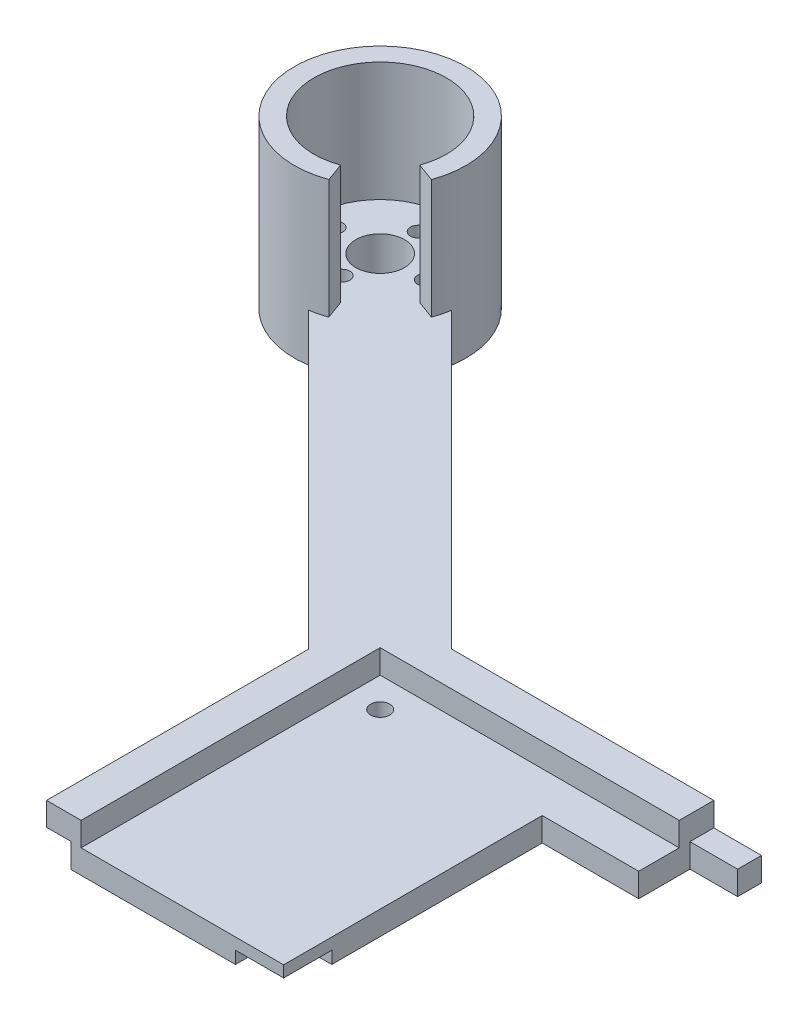
ISO-10303-21;
HEADER;
FILE_DESCRIPTION(('STEP AP214'),'2;1');
FILE_NAME('part.step','',(''),(''),'','','');
FILE_SCHEMA(('AUTOMOTIVE_DESIGN { 1 0 10303 214 1 1 1 1 }'));
ENDSEC;
DATA;
#1=APPLICATION_CONTEXT('core data for automotive mechanical design processes');
#2=APPLICATION_PROTOCOL_DEFINITION('international standard','automotive_design',2000,#1);
#3=PRODUCT_CONTEXT('',#1,'mechanical');
#4=PRODUCT('Part','Part','',(#3));
#5=PRODUCT_RELATED_PRODUCT_CATEGORY('part','',(#4));
#6=PRODUCT_DEFINITION_FORMATION('','',#4);
#7=PRODUCT_DEFINITION_CONTEXT('part definition',#1,'design');
#8=PRODUCT_DEFINITION('design','',#6,#7);
#9=PRODUCT_DEFINITION_SHAPE('','',#8);
#10=(LENGTH_UNIT() NAMED_UNIT(*) SI_UNIT(.MILLI.,.METRE.));
#11=(NAMED_UNIT(*) PLANE_ANGLE_UNIT() SI_UNIT($,.RADIAN.));
#12=(NAMED_UNIT(*) SI_UNIT($,.STERADIAN.) SOLID_ANGLE_UNIT());
#13=UNCERTAINTY_MEASURE_WITH_UNIT(LENGTH_MEASURE(1.E-05),#10,'distance_accuracy_value','');
#14=(GEOMETRIC_REPRESENTATION_CONTEXT(3) GLOBAL_UNCERTAINTY_ASSIGNED_CONTEXT((#13)) GLOBAL_UNIT_ASSIGNED_CONTEXT((#10,
#11,#12)) REPRESENTATION_CONTEXT('',''));
#15=CARTESIAN_POINT('',(0.,0.,0.));
#16=DIRECTION('',(0.,0.,1.));
#17=DIRECTION('',(1.,0.,0.));
#18=AXIS2_PLACEMENT_3D('',#15,#16,#17);
#19=CARTESIAN_POINT('',(0.,-10.01,-249.205352090915));
#20=DIRECTION('',(-1.,0.,0.));
#21=DIRECTION('',(0.,0.,1.));
#22=AXIS2_PLACEMENT_3D('',#19,#20,#21);
#23=PLANE('',#22);
#24=DIRECTION('',(0.,-1.,0.));
#25=VECTOR('',#24,1.);
#26=CARTESIAN_POINT('',(0.,-10.,-65.));
#27=LINE('',#26,#25);
#28=CARTESIAN_POINT('',(0.,-5.,-65.));
#29=VERTEX_POINT('',#28);
#30=CARTESIAN_POINT('',(0.,-10.,-65.));
#31=VERTEX_POINT('',#30);
#32=EDGE_CURVE('E279',#29,#31,#27,.T.);
#33=ORIENTED_EDGE('',*,*,#32,.F.);
#34=DIRECTION('',(0.,0.,1.));
#35=VECTOR('',#34,1.);
#36=CARTESIAN_POINT('',(0.,-5.,-70.));
#37=LINE('',#36,#35);
#38=CARTESIAN_POINT('',(0.,-5.,-70.));
#39=VERTEX_POINT('',#38);
#40=EDGE_CURVE('E290',#39,#29,#37,.T.);
#41=ORIENTED_EDGE('',*,*,#40,.F.);
#42=DIRECTION('',(0.,1.,0.));
#43=VECTOR('',#42,1.);
#44=CARTESIAN_POINT('',(0.,-10.,-70.));
#45=LINE('',#44,#43);
#46=CARTESIAN_POINT('',(0.,0.,-70.));
#47=VERTEX_POINT('',#46);
#48=EDGE_CURVE('E493',#39,#47,#45,.T.);
#49=ORIENTED_EDGE('',*,*,#48,.T.);
#50=DIRECTION('',(0.,0.,1.));
#51=VECTOR('',#50,1.);
#52=CARTESIAN_POINT('',(0.,0.,-134.350288425444));
#53=LINE('',#52,#51);
#54=CARTESIAN_POINT('',(0.,0.,-62.75));
#55=VERTEX_POINT('',#54);
#56=EDGE_CURVE('E489',#47,#55,#53,.T.);
#57=ORIENTED_EDGE('',*,*,#56,.T.);
#58=DIRECTION('',(0.,1.,0.));
#59=VECTOR('',#58,1.);
#60=CARTESIAN_POINT('',(0.,-5.,-62.75));
#61=LINE('',#60,#59);
#62=CARTESIAN_POINT('',(0.,-5.,-62.75));
#63=VERTEX_POINT('',#62);
#64=EDGE_CURVE('E469',#63,#55,#61,.T.);
#65=ORIENTED_EDGE('',*,*,#64,.F.);
#66=DIRECTION('',(0.,0.,1.));
#67=VECTOR('',#66,1.);
#68=CARTESIAN_POINT('',(0.,-5.,0.));
#69=LINE('',#68,#67);
#70=CARTESIAN_POINT('',(0.,-5.,-54.25));
#71=VERTEX_POINT('',#70);
#72=EDGE_CURVE('E51',#63,#71,#69,.T.);
#73=ORIENTED_EDGE('',*,*,#72,.T.);
#74=DIRECTION('',(0.,1.,0.));
#75=VECTOR('',#74,1.);
#76=CARTESIAN_POINT('',(0.,-10.,-54.25));
#77=LINE('',#76,#75);
#78=CARTESIAN_POINT('',(0.,-10.,-54.25));
#79=VERTEX_POINT('',#78);
#80=EDGE_CURVE('E495',#79,#71,#77,.T.);
#81=ORIENTED_EDGE('',*,*,#80,.F.);
#82=DIRECTION('',(0.,0.,1.));
#83=VECTOR('',#82,1.);
#84=CARTESIAN_POINT('',(0.,-10.,-134.350288425444));
#85=LINE('',#84,#83);
#86=EDGE_CURVE('E499',#31,#79,#85,.T.);
#87=ORIENTED_EDGE('',*,*,#86,.F.);
#88=EDGE_LOOP('',(#33,#41,#49,#57,#65,#73,#81,#87));
#89=FACE_BOUND('',#88,.T.);
#90=ADVANCED_FACE('F41',(#89),#23,.F.);
#91=CARTESIAN_POINT('',(-210.827922049848,-10.01,0.));
#92=DIRECTION('',(0.,0.,1.));
#93=DIRECTION('',(1.,0.,0.));
#94=AXIS2_PLACEMENT_3D('',#91,#92,#93);
#95=PLANE('',#94);
#96=DIRECTION('',(-1.,0.,0.));
#97=VECTOR('',#96,1.);
#98=CARTESIAN_POINT('',(-70.,-4.9,0.));
#99=LINE('',#98,#97);
#100=CARTESIAN_POINT('',(-64.9,-4.9,0.));
#101=VERTEX_POINT('',#100);
#102=CARTESIAN_POINT('',(-70.,-4.9,0.));
#103=VERTEX_POINT('',#102);
#104=EDGE_CURVE('E517',#101,#103,#99,.T.);
#105=ORIENTED_EDGE('',*,*,#104,.F.);
#106=DIRECTION('',(0.,1.,0.));
#107=VECTOR('',#106,1.);
#108=CARTESIAN_POINT('',(-64.9,-10.,0.));
#109=LINE('',#108,#107);
#110=CARTESIAN_POINT('',(-64.9,-10.,0.));
#111=VERTEX_POINT('',#110);
#112=EDGE_CURVE('E268',#111,#101,#109,.T.);
#113=ORIENTED_EDGE('',*,*,#112,.F.);
#114=DIRECTION('',(1.,0.,0.));
#115=VECTOR('',#114,1.);
#116=CARTESIAN_POINT('',(134.350288425444,-10.,0.));
#117=LINE('',#116,#115);
#118=CARTESIAN_POINT('',(-30.35,-10.,0.));
#119=VERTEX_POINT('',#118);
#120=EDGE_CURVE('E235',#111,#119,#117,.T.);
#121=ORIENTED_EDGE('',*,*,#120,.T.);
#122=DIRECTION('',(0.,-1.,0.));
#123=VECTOR('',#122,1.);
#124=CARTESIAN_POINT('',(-30.35,-10.,0.));
#125=LINE('',#124,#123);
#126=CARTESIAN_POINT('',(-30.35,-7.4,0.));
#127=VERTEX_POINT('',#126);
#128=EDGE_CURVE('E250',#127,#119,#125,.T.);
#129=ORIENTED_EDGE('',*,*,#128,.F.);
#130=DIRECTION('',(-1.,0.,0.));
#131=VECTOR('',#130,1.);
#132=CARTESIAN_POINT('',(-20.25,-7.4,0.));
#133=LINE('',#132,#131);
#134=CARTESIAN_POINT('',(-20.25,-7.4,0.));
#135=VERTEX_POINT('',#134);
#136=EDGE_CURVE('E259',#135,#127,#133,.T.);
#137=ORIENTED_EDGE('',*,*,#136,.F.);
#138=DIRECTION('',(0.,1.,0.));
#139=VECTOR('',#138,1.);
#140=CARTESIAN_POINT('',(-20.25,-10.,0.));
#141=LINE('',#140,#139);
#142=CARTESIAN_POINT('',(-20.25,-5.,0.));
#143=VERTEX_POINT('',#142);
#144=EDGE_CURVE('E494',#135,#143,#141,.T.);
#145=ORIENTED_EDGE('',*,*,#144,.T.);
#146=DIRECTION('',(1.,0.,0.));
#147=VECTOR('',#146,1.);
#148=CARTESIAN_POINT('',(0.,-5.,0.));
#149=LINE('',#148,#147);
#150=CARTESIAN_POINT('',(-62.75,-5.,0.));
#151=VERTEX_POINT('',#150);
#152=EDGE_CURVE('E484',#151,#143,#149,.T.);
#153=ORIENTED_EDGE('',*,*,#152,.F.);
#154=DIRECTION('',(0.,1.,0.));
#155=VECTOR('',#154,1.);
#156=CARTESIAN_POINT('',(-62.75,-5.,0.));
#157=LINE('',#156,#155);
#158=CARTESIAN_POINT('',(-62.75,0.,0.));
#159=VERTEX_POINT('',#158);
#160=EDGE_CURVE('E11',#151,#159,#157,.T.);
#161=ORIENTED_EDGE('',*,*,#160,.T.);
#162=DIRECTION('',(1.,0.,0.));
#163=VECTOR('',#162,1.);
#164=CARTESIAN_POINT('',(134.350288425444,0.,0.));
#165=LINE('',#164,#163);
#166=CARTESIAN_POINT('',(-70.,0.,0.));
#167=VERTEX_POINT('',#166);
#168=EDGE_CURVE('E498',#167,#159,#165,.T.);
#169=ORIENTED_EDGE('',*,*,#168,.F.);
#170=DIRECTION('',(0.,1.,0.));
#171=VECTOR('',#170,1.);
#172=CARTESIAN_POINT('',(-70.,-10.,0.));
#173=LINE('',#172,#171);
#174=EDGE_CURVE('E45',#103,#167,#173,.T.);
#175=ORIENTED_EDGE('',*,*,#174,.F.);
#176=EDGE_LOOP('',(#105,#113,#121,#129,#137,#145,#153,#161,#169,#175));
#177=FACE_BOUND('',#176,.T.);
#178=ADVANCED_FACE('F43',(#177),#95,.T.);
#179=CARTESIAN_POINT('',(0.,25.,0.));
#180=DIRECTION('',(0.,1.,0.));
#181=DIRECTION('',(1.,0.,0.));
#182=AXIS2_PLACEMENT_3D('',#179,#180,#181);
#183=PLANE('',#182);
#184=CARTESIAN_POINT('',(-134.350288425443,25.,-134.350288425445));
#185=DIRECTION('',(0.,1.,0.));
#186=DIRECTION('',(1.,0.,0.));
#187=AXIS2_PLACEMENT_3D('',#184,#185,#186);
#188=CIRCLE('',#187,18.);
#189=CARTESIAN_POINT('',(-117.435821251297,25.,-128.193925845584));
#190=VERTEX_POINT('',#189);
#191=CARTESIAN_POINT('',(-128.193925845581,25.,-117.4358212513));
#192=VERTEX_POINT('',#191);
#193=EDGE_CURVE('E333',#190,#192,#188,.T.);
#194=ORIENTED_EDGE('',*,*,#193,.T.);
#195=DIRECTION('',(0.342020143325692,0.,0.9396926207859));
#196=VECTOR('',#195,1.);
#197=CARTESIAN_POINT('',(-75.4549397737436,25.,27.4633521059938));
#198=LINE('',#197,#196);
#199=CARTESIAN_POINT('',(-129.596208433216,25.,-121.288560996521));
#200=VERTEX_POINT('',#199);
#201=EDGE_CURVE('E336',#200,#192,#198,.T.);
#202=ORIENTED_EDGE('',*,*,#201,.F.);
#203=CARTESIAN_POINT('',(-134.350288425443,25.,-134.350288425445));
#204=DIRECTION('',(0.,1.,0.));
#205=DIRECTION('',(1.,0.,0.));
#206=AXIS2_PLACEMENT_3D('',#203,#204,#205);
#207=CIRCLE('',#206,13.9);
#208=CARTESIAN_POINT('',(-121.288560996518,25.,-129.596208433219));
#209=VERTEX_POINT('',#208);
#210=EDGE_CURVE('E341',#209,#200,#207,.T.);
#211=ORIENTED_EDGE('',*,*,#210,.F.);
#212=DIRECTION('',(-0.939692620785907,0.,-0.342020143325674));
#213=VECTOR('',#212,1.);
#214=CARTESIAN_POINT('',(27.4633521059948,25.,-75.454939773751));
#215=LINE('',#214,#213);
#216=EDGE_CURVE('E345',#190,#209,#215,.T.);
#217=ORIENTED_EDGE('',*,*,#216,.F.);
#218=EDGE_LOOP('',(#194,#202,#211,#217));
#219=FACE_BOUND('',#218,.T.);
#220=ADVANCED_FACE('F544',(#219),#183,.T.);
#221=CARTESIAN_POINT('',(-75.4549397737436,25.,27.4633521059938));
#222=DIRECTION('',(0.9396926207859,0.,-0.342020143325692));
#223=DIRECTION('',(-0.342020143325692,0.,-0.9396926207859));
#224=AXIS2_PLACEMENT_3D('',#221,#222,#223);
#225=PLANE('',#224);
#226=DIRECTION('',(0.342020143325692,0.,0.9396926207859));
#227=VECTOR('',#226,1.);
#228=CARTESIAN_POINT('',(-75.4549397737436,0.,27.4633521059938));
#229=LINE('',#228,#227);
#230=CARTESIAN_POINT('',(-129.596208433216,0.,-121.288560996521));
#231=VERTEX_POINT('',#230);
#232=CARTESIAN_POINT('',(-128.193925845581,0.,-117.4358212513));
#233=VERTEX_POINT('',#232);
#234=EDGE_CURVE('E354',#231,#233,#229,.T.);
#235=ORIENTED_EDGE('',*,*,#234,.F.);
#236=DIRECTION('',(0.,-1.,0.));
#237=VECTOR('',#236,1.);
#238=CARTESIAN_POINT('',(-129.596208433216,25.,-121.288560996521));
#239=LINE('',#238,#237);
#240=EDGE_CURVE('E369',#200,#231,#239,.T.);
#241=ORIENTED_EDGE('',*,*,#240,.F.);
#242=ORIENTED_EDGE('',*,*,#201,.T.);
#243=DIRECTION('',(0.,-1.,0.));
#244=VECTOR('',#243,1.);
#245=CARTESIAN_POINT('',(-128.193925845581,25.,-117.4358212513));
#246=LINE('',#245,#244);
#247=EDGE_CURVE('E373',#192,#233,#246,.T.);
#248=ORIENTED_EDGE('',*,*,#247,.T.);
#249=EDGE_LOOP('',(#235,#241,#242,#248));
#250=FACE_BOUND('',#249,.T.);
#251=ADVANCED_FACE('F540',(#250),#225,.T.);
#252=CARTESIAN_POINT('',(-134.350288425443,25.,-134.350288425445));
#253=DIRECTION('',(0.,-1.,0.));
#254=DIRECTION('',(0.,0.,-1.));
#255=AXIS2_PLACEMENT_3D('',#252,#253,#254);
#256=CYLINDRICAL_SURFACE('',#255,13.9);
#257=CARTESIAN_POINT('',(-134.350288425443,0.,-134.350288425445));
#258=DIRECTION('',(0.,1.,0.));
#259=DIRECTION('',(1.,0.,0.));
#260=AXIS2_PLACEMENT_3D('',#257,#258,#259);
#261=CIRCLE('',#260,13.9);
#262=CARTESIAN_POINT('',(-121.288560996518,0.,-129.596208433219));
#263=VERTEX_POINT('',#262);
#264=EDGE_CURVE('E357',#263,#231,#261,.T.);
#265=ORIENTED_EDGE('',*,*,#264,.F.);
#266=DIRECTION('',(0.,-1.,0.));
#267=VECTOR('',#266,1.);
#268=CARTESIAN_POINT('',(-121.288560996518,25.,-129.596208433219));
#269=LINE('',#268,#267);
#270=EDGE_CURVE('E365',#209,#263,#269,.T.);
#271=ORIENTED_EDGE('',*,*,#270,.F.);
#272=ORIENTED_EDGE('',*,*,#210,.T.);
#273=ORIENTED_EDGE('',*,*,#240,.T.);
#274=EDGE_LOOP('',(#265,#271,#272,#273));
#275=FACE_BOUND('',#274,.T.);
#276=ADVANCED_FACE('F548',(#275),#256,.F.);
#277=CARTESIAN_POINT('',(27.4633521059948,25.,-75.454939773751));
#278=DIRECTION('',(-0.342020143325674,0.,0.939692620785907));
#279=DIRECTION('',(0.939692620785907,0.,0.342020143325674));
#280=AXIS2_PLACEMENT_3D('',#277,#278,#279);
#281=PLANE('',#280);
#282=DIRECTION('',(-0.939692620785907,0.,-0.342020143325674));
#283=VECTOR('',#282,1.);
#284=CARTESIAN_POINT('',(27.4633521059948,0.,-75.454939773751));
#285=LINE('',#284,#283);
#286=CARTESIAN_POINT('',(-117.435821251297,0.,-128.193925845584));
#287=VERTEX_POINT('',#286);
#288=EDGE_CURVE('E337',#287,#263,#285,.T.);
#289=ORIENTED_EDGE('',*,*,#288,.F.);
#290=DIRECTION('',(0.,-1.,0.));
#291=VECTOR('',#290,1.);
#292=CARTESIAN_POINT('',(-117.435821251297,25.,-128.193925845584));
#293=LINE('',#292,#291);
#294=EDGE_CURVE('E349',#190,#287,#293,.T.);
#295=ORIENTED_EDGE('',*,*,#294,.F.);
#296=ORIENTED_EDGE('',*,*,#216,.T.);
#297=ORIENTED_EDGE('',*,*,#270,.T.);
#298=EDGE_LOOP('',(#289,#295,#296,#297));
#299=FACE_BOUND('',#298,.T.);
#300=ADVANCED_FACE('F551',(#299),#281,.T.);
#301=CARTESIAN_POINT('',(-55.,-10.,-70.));
#302=DIRECTION('',(0.,0.,-1.));
#303=DIRECTION('',(-1.,0.,0.));
#304=AXIS2_PLACEMENT_3D('',#301,#302,#303);
#305=PLANE('',#304);
#306=ORIENTED_EDGE('',*,*,#48,.F.);
#307=DIRECTION('',(-1.,0.,0.));
#308=VECTOR('',#307,1.);
#309=CARTESIAN_POINT('',(10.,-5.,-70.));
#310=LINE('',#309,#308);
#311=CARTESIAN_POINT('',(10.,-5.,-70.));
#312=VERTEX_POINT('',#311);
#313=EDGE_CURVE('E304',#312,#39,#310,.T.);
#314=ORIENTED_EDGE('',*,*,#313,.F.);
#315=DIRECTION('',(0.,1.,0.));
#316=VECTOR('',#315,1.);
#317=CARTESIAN_POINT('',(10.,-10.,-70.));
#318=LINE('',#317,#316);
#319=CARTESIAN_POINT('',(10.,-10.,-70.));
#320=VERTEX_POINT('',#319);
#321=EDGE_CURVE('E274',#320,#312,#318,.T.);
#322=ORIENTED_EDGE('',*,*,#321,.F.);
#323=DIRECTION('',(-1.,0.,0.));
#324=VECTOR('',#323,1.);
#325=CARTESIAN_POINT('',(-55.,-10.,-70.));
#326=LINE('',#325,#324);
#327=CARTESIAN_POINT('',(-55.,-10.,-70.));
#328=VERTEX_POINT('',#327);
#329=EDGE_CURVE('E433',#320,#328,#326,.T.);
#330=ORIENTED_EDGE('',*,*,#329,.T.);
#331=DIRECTION('',(0.,1.,0.));
#332=VECTOR('',#331,1.);
#333=CARTESIAN_POINT('',(-55.,-10.,-70.));
#334=LINE('',#333,#332);
#335=CARTESIAN_POINT('',(-55.,0.,-70.));
#336=VERTEX_POINT('',#335);
#337=EDGE_CURVE('E452',#328,#336,#334,.T.);
#338=ORIENTED_EDGE('',*,*,#337,.T.);
#339=DIRECTION('',(-1.,0.,0.));
#340=VECTOR('',#339,1.);
#341=CARTESIAN_POINT('',(-55.,0.,-70.));
#342=LINE('',#341,#340);
#343=EDGE_CURVE('E432',#47,#336,#342,.T.);
#344=ORIENTED_EDGE('',*,*,#343,.F.);
#345=EDGE_LOOP('',(#306,#314,#322,#330,#338,#344));
#346=FACE_BOUND('',#345,.T.);
#347=ADVANCED_FACE('F580',(#346),#305,.T.);
#348=CARTESIAN_POINT('',(-55.,-10.,-70.));
#349=DIRECTION('',(0.707106781186547,0.,-0.707106781186548));
#350=DIRECTION('',(-0.707106781186548,0.,-0.707106781186547));
#351=AXIS2_PLACEMENT_3D('',#348,#349,#350);
#352=PLANE('',#351);
#353=DIRECTION('',(-0.707106781186548,0.,-0.707106781186547));
#354=VECTOR('',#353,1.);
#355=CARTESIAN_POINT('',(-55.,0.,-70.));
#356=LINE('',#355,#354);
#357=CARTESIAN_POINT('',(-116.566806524842,0.,-131.566806524842));
#358=VERTEX_POINT('',#357);
#359=EDGE_CURVE('E455',#336,#358,#356,.T.);
#360=ORIENTED_EDGE('',*,*,#359,.F.);
#361=ORIENTED_EDGE('',*,*,#337,.F.);
#362=DIRECTION('',(-0.707106781186548,0.,-0.707106781186547));
#363=VECTOR('',#362,1.);
#364=CARTESIAN_POINT('',(-55.,-10.,-70.));
#365=LINE('',#364,#363);
#366=CARTESIAN_POINT('',(-116.566806524842,-10.,-131.566806524842));
#367=VERTEX_POINT('',#366);
#368=EDGE_CURVE('E436',#328,#367,#365,.T.);
#369=ORIENTED_EDGE('',*,*,#368,.T.);
#370=DIRECTION('',(0.,1.,0.));
#371=VECTOR('',#370,1.);
#372=CARTESIAN_POINT('',(-116.566806524842,-10.,-131.566806524842));
#373=LINE('',#372,#371);
#374=EDGE_CURVE('E474',#367,#358,#373,.T.);
#375=ORIENTED_EDGE('',*,*,#374,.T.);
#376=EDGE_LOOP('',(#360,#361,#369,#375));
#377=FACE_BOUND('',#376,.T.);
#378=ADVANCED_FACE('F559',(#377),#352,.T.);
#379=CARTESIAN_POINT('',(-134.350288425444,-10.,-134.350288425444));
#380=DIRECTION('',(0.,1.,0.));
#381=DIRECTION('',(0.,0.,1.));
#382=AXIS2_PLACEMENT_3D('',#379,#380,#381);
#383=CYLINDRICAL_SURFACE('',#382,18.);
#384=DIRECTION('',(0.,1.,0.));
#385=VECTOR('',#384,1.);
#386=CARTESIAN_POINT('',(-131.566806524842,-10.,-116.566806524842));
#387=LINE('',#386,#385);
#388=CARTESIAN_POINT('',(-131.566806524842,-10.,-116.566806524842));
#389=VERTEX_POINT('',#388);
#390=CARTESIAN_POINT('',(-131.566806524843,0.,-116.566806524844));
#391=VERTEX_POINT('',#390);
#392=EDGE_CURVE('E470',#389,#391,#387,.T.);
#393=ORIENTED_EDGE('',*,*,#392,.T.);
#394=CARTESIAN_POINT('',(-134.350288425443,0.,-134.350288425445));
#395=DIRECTION('',(0.,1.,0.));
#396=DIRECTION('',(1.,0.,0.));
#397=AXIS2_PLACEMENT_3D('',#394,#395,#396);
#398=CIRCLE('',#397,18.);
#399=EDGE_CURVE('E332',#391,#233,#398,.T.);
#400=ORIENTED_EDGE('',*,*,#399,.T.);
#401=ORIENTED_EDGE('',*,*,#247,.F.);
#402=ORIENTED_EDGE('',*,*,#193,.F.);
#403=ORIENTED_EDGE('',*,*,#294,.T.);
#404=EDGE_CURVE('E350',#287,#358,#398,.T.);
#405=ORIENTED_EDGE('',*,*,#404,.T.);
#406=ORIENTED_EDGE('',*,*,#374,.F.);
#407=CARTESIAN_POINT('',(-134.350288425444,-10.,-134.350288425444));
#408=DIRECTION('',(0.,1.,0.));
#409=DIRECTION('',(0.,0.,1.));
#410=AXIS2_PLACEMENT_3D('',#407,#408,#409);
#411=CIRCLE('',#410,18.);
#412=EDGE_CURVE('E441',#367,#389,#411,.T.);
#413=ORIENTED_EDGE('',*,*,#412,.T.);
#414=EDGE_LOOP('',(#393,#400,#401,#402,#403,#405,#406,#413));
#415=FACE_BOUND('',#414,.T.);
#416=ADVANCED_FACE('F535',(#415),#383,.T.);
#417=CARTESIAN_POINT('',(-70.,-10.,-55.));
#418=DIRECTION('',(-0.707106781186547,0.,0.707106781186548));
#419=DIRECTION('',(0.707106781186548,0.,0.707106781186547));
#420=AXIS2_PLACEMENT_3D('',#417,#418,#419);
#421=PLANE('',#420);
#422=DIRECTION('',(0.707106781186548,0.,0.707106781186547));
#423=VECTOR('',#422,1.);
#424=CARTESIAN_POINT('',(-70.,0.,-55.));
#425=LINE('',#424,#423);
#426=CARTESIAN_POINT('',(-70.,0.,-55.));
#427=VERTEX_POINT('',#426);
#428=EDGE_CURVE('E459',#391,#427,#425,.T.);
#429=ORIENTED_EDGE('',*,*,#428,.F.);
#430=ORIENTED_EDGE('',*,*,#392,.F.);
#431=DIRECTION('',(0.707106781186548,0.,0.707106781186547));
#432=VECTOR('',#431,1.);
#433=CARTESIAN_POINT('',(-70.,-10.,-55.));
#434=LINE('',#433,#432);
#435=CARTESIAN_POINT('',(-70.,-10.,-55.));
#436=VERTEX_POINT('',#435);
#437=EDGE_CURVE('E445',#389,#436,#434,.T.);
#438=ORIENTED_EDGE('',*,*,#437,.T.);
#439=DIRECTION('',(0.,1.,0.));
#440=VECTOR('',#439,1.);
#441=CARTESIAN_POINT('',(-70.,-10.,-55.));
#442=LINE('',#441,#440);
#443=EDGE_CURVE('E466',#436,#427,#442,.T.);
#444=ORIENTED_EDGE('',*,*,#443,.T.);
#445=EDGE_LOOP('',(#429,#430,#438,#444));
#446=FACE_BOUND('',#445,.T.);
#447=ADVANCED_FACE('F564',(#446),#421,.T.);
#448=CARTESIAN_POINT('',(-70.,-10.,-55.));
#449=DIRECTION('',(-1.,0.,0.));
#450=DIRECTION('',(0.,0.,1.));
#451=AXIS2_PLACEMENT_3D('',#448,#449,#450);
#452=PLANE('',#451);
#453=DIRECTION('',(0.,0.,1.));
#454=VECTOR('',#453,1.);
#455=CARTESIAN_POINT('',(-70.,-4.9,-10.1));
#456=LINE('',#455,#454);
#457=CARTESIAN_POINT('',(-70.,-4.9,-10.1));
#458=VERTEX_POINT('',#457);
#459=EDGE_CURVE('E240',#458,#103,#456,.T.);
#460=ORIENTED_EDGE('',*,*,#459,.T.);
#461=ORIENTED_EDGE('',*,*,#174,.T.);
#462=DIRECTION('',(0.,0.,1.));
#463=VECTOR('',#462,1.);
#464=CARTESIAN_POINT('',(-70.,0.,-55.));
#465=LINE('',#464,#463);
#466=EDGE_CURVE('E437',#427,#167,#465,.T.);
#467=ORIENTED_EDGE('',*,*,#466,.F.);
#468=ORIENTED_EDGE('',*,*,#443,.F.);
#469=DIRECTION('',(0.,0.,1.));
#470=VECTOR('',#469,1.);
#471=CARTESIAN_POINT('',(-70.,-10.,-55.));
#472=LINE('',#471,#470);
#473=CARTESIAN_POINT('',(-70.,-10.,-10.1));
#474=VERTEX_POINT('',#473);
#475=EDGE_CURVE('E449',#436,#474,#472,.T.);
#476=ORIENTED_EDGE('',*,*,#475,.T.);
#477=DIRECTION('',(0.,-1.,0.));
#478=VECTOR('',#477,1.);
#479=CARTESIAN_POINT('',(-70.,-10.,-10.1));
#480=LINE('',#479,#478);
#481=EDGE_CURVE('E67',#458,#474,#480,.T.);
#482=ORIENTED_EDGE('',*,*,#481,.F.);
#483=EDGE_LOOP('',(#460,#461,#467,#468,#476,#482));
#484=FACE_BOUND('',#483,.T.);
#485=ADVANCED_FACE('F525',(#484),#452,.T.);
#486=CARTESIAN_POINT('',(-134.350288425444,-10.,-134.350288425444));
#487=DIRECTION('',(0.,1.,0.));
#488=DIRECTION('',(0.,0.,1.));
#489=AXIS2_PLACEMENT_3D('',#486,#487,#488);
#490=CYLINDRICAL_SURFACE('',#489,5.10000000000054);
#491=CARTESIAN_POINT('',(-134.350288425444,-10.,-134.350288425444));
#492=DIRECTION('',(0.,1.,0.));
#493=DIRECTION('',(0.,0.,1.));
#494=AXIS2_PLACEMENT_3D('',#491,#492,#493);
#495=CIRCLE('',#494,5.10000000000054);
#496=CARTESIAN_POINT('',(-134.350288425444,-10.,-129.250288425444));
#497=VERTEX_POINT('',#496);
#498=EDGE_CURVE('E378',#497,#497,#495,.T.);
#499=ORIENTED_EDGE('',*,*,#498,.F.);
#500=EDGE_LOOP('',(#499));
#501=FACE_BOUND('',#500,.T.);
#502=CARTESIAN_POINT('',(-134.350288425444,0.,-134.350288425444));
#503=DIRECTION('',(0.,1.,0.));
#504=DIRECTION('',(0.,0.,1.));
#505=AXIS2_PLACEMENT_3D('',#502,#503,#504);
#506=CIRCLE('',#505,5.10000000000054);
#507=CARTESIAN_POINT('',(-134.350288425444,0.,-129.250288425444));
#508=VERTEX_POINT('',#507);
#509=EDGE_CURVE('E377',#508,#508,#506,.T.);
#510=ORIENTED_EDGE('',*,*,#509,.T.);
#511=EDGE_LOOP('',(#510));
#512=FACE_BOUND('',#511,.T.);
#513=ADVANCED_FACE('F622',(#501,#512),#490,.F.);
#514=CARTESIAN_POINT('',(-143.850288425444,-10.,-134.350288425444));
#515=DIRECTION('',(0.,1.,0.));
#516=DIRECTION('',(0.,0.,1.));
#517=AXIS2_PLACEMENT_3D('',#514,#515,#516);
#518=CYLINDRICAL_SURFACE('',#517,1.65000000000002);
#519=CARTESIAN_POINT('',(-143.850288425444,-10.,-134.350288425444));
#520=DIRECTION('',(0.,1.,0.));
#521=DIRECTION('',(0.,0.,1.));
#522=AXIS2_PLACEMENT_3D('',#519,#520,#521);
#523=CIRCLE('',#522,1.65000000000002);
#524=CARTESIAN_POINT('',(-143.850288425444,-10.,-132.700288425444));
#525=VERTEX_POINT('',#524);
#526=EDGE_CURVE('E386',#525,#525,#523,.T.);
#527=ORIENTED_EDGE('',*,*,#526,.F.);
#528=EDGE_LOOP('',(#527));
#529=FACE_BOUND('',#528,.T.);
#530=CARTESIAN_POINT('',(-143.850288425444,0.,-134.350288425444));
#531=DIRECTION('',(0.,1.,0.));
#532=DIRECTION('',(0.,0.,1.));
#533=AXIS2_PLACEMENT_3D('',#530,#531,#532);
#534=CIRCLE('',#533,1.65000000000002);
#535=CARTESIAN_POINT('',(-143.850288425444,0.,-132.700288425444));
#536=VERTEX_POINT('',#535);
#537=EDGE_CURVE('E382',#536,#536,#534,.T.);
#538=ORIENTED_EDGE('',*,*,#537,.T.);
#539=EDGE_LOOP('',(#538));
#540=FACE_BOUND('',#539,.T.);
#541=ADVANCED_FACE('F650',(#529,#540),#518,.F.);
#542=CARTESIAN_POINT('',(-134.350288425444,-10.,-142.350288425444));
#543=DIRECTION('',(0.,1.,0.));
#544=DIRECTION('',(0.,0.,1.));
#545=AXIS2_PLACEMENT_3D('',#542,#543,#544);
#546=CYLINDRICAL_SURFACE('',#545,1.65000000000065);
#547=CARTESIAN_POINT('',(-134.350288425444,-10.,-142.350288425444));
#548=DIRECTION('',(0.,1.,0.));
#549=DIRECTION('',(0.,0.,1.));
#550=AXIS2_PLACEMENT_3D('',#547,#548,#549);
#551=CIRCLE('',#550,1.65000000000065);
#552=CARTESIAN_POINT('',(-134.350288425444,-10.,-140.700288425443));
#553=VERTEX_POINT('',#552);
#554=EDGE_CURVE('E394',#553,#553,#551,.T.);
#555=ORIENTED_EDGE('',*,*,#554,.F.);
#556=EDGE_LOOP('',(#555));
#557=FACE_BOUND('',#556,.T.);
#558=CARTESIAN_POINT('',(-134.350288425444,0.,-142.350288425444));
#559=DIRECTION('',(0.,1.,0.));
#560=DIRECTION('',(0.,0.,1.));
#561=AXIS2_PLACEMENT_3D('',#558,#559,#560);
#562=CIRCLE('',#561,1.65000000000065);
#563=CARTESIAN_POINT('',(-134.350288425444,0.,-140.700288425443));
#564=VERTEX_POINT('',#563);
#565=EDGE_CURVE('E390',#564,#564,#562,.T.);
#566=ORIENTED_EDGE('',*,*,#565,.T.);
#567=EDGE_LOOP('',(#566));
#568=FACE_BOUND('',#567,.T.);
#569=ADVANCED_FACE('F646',(#557,#568),#546,.F.);
#570=CARTESIAN_POINT('',(-134.350288425444,-10.,-126.350288425444));
#571=DIRECTION('',(0.,1.,0.));
#572=DIRECTION('',(0.,0.,1.));
#573=AXIS2_PLACEMENT_3D('',#570,#571,#572);
#574=CYLINDRICAL_SURFACE('',#573,1.65000000000002);
#575=CARTESIAN_POINT('',(-134.350288425444,-10.,-126.350288425444));
#576=DIRECTION('',(0.,1.,0.));
#577=DIRECTION('',(0.,0.,1.));
#578=AXIS2_PLACEMENT_3D('',#575,#576,#577);
#579=CIRCLE('',#578,1.65000000000002);
#580=CARTESIAN_POINT('',(-134.350288425444,-10.,-124.700288425444));
#581=VERTEX_POINT('',#580);
#582=EDGE_CURVE('E402',#581,#581,#579,.T.);
#583=ORIENTED_EDGE('',*,*,#582,.F.);
#584=EDGE_LOOP('',(#583));
#585=FACE_BOUND('',#584,.T.);
#586=CARTESIAN_POINT('',(-134.350288425444,0.,-126.350288425444));
#587=DIRECTION('',(0.,1.,0.));
#588=DIRECTION('',(0.,0.,1.));
#589=AXIS2_PLACEMENT_3D('',#586,#587,#588);
#590=CIRCLE('',#589,1.65000000000002);
#591=CARTESIAN_POINT('',(-134.350288425444,0.,-124.700288425444));
#592=VERTEX_POINT('',#591);
#593=EDGE_CURVE('E398',#592,#592,#590,.T.);
#594=ORIENTED_EDGE('',*,*,#593,.T.);
#595=EDGE_LOOP('',(#594));
#596=FACE_BOUND('',#595,.T.);
#597=ADVANCED_FACE('F642',(#585,#596),#574,.F.);
#598=CARTESIAN_POINT('',(-124.850288425444,-10.,-134.350288425444));
#599=DIRECTION('',(0.,1.,0.));
#600=DIRECTION('',(0.,0.,1.));
#601=AXIS2_PLACEMENT_3D('',#598,#599,#600);
#602=CYLINDRICAL_SURFACE('',#601,1.65000000000054);
#603=CARTESIAN_POINT('',(-124.850288425444,-10.,-134.350288425444));
#604=DIRECTION('',(0.,1.,0.));
#605=DIRECTION('',(0.,0.,1.));
#606=AXIS2_PLACEMENT_3D('',#603,#604,#605);
#607=CIRCLE('',#606,1.65000000000054);
#608=CARTESIAN_POINT('',(-124.850288425444,-10.,-132.700288425443));
#609=VERTEX_POINT('',#608);
#610=EDGE_CURVE('E410',#609,#609,#607,.T.);
#611=ORIENTED_EDGE('',*,*,#610,.F.);
#612=EDGE_LOOP('',(#611));
#613=FACE_BOUND('',#612,.T.);
#614=CARTESIAN_POINT('',(-124.850288425444,0.,-134.350288425444));
#615=DIRECTION('',(0.,1.,0.));
#616=DIRECTION('',(0.,0.,1.));
#617=AXIS2_PLACEMENT_3D('',#614,#615,#616);
#618=CIRCLE('',#617,1.65000000000054);
#619=CARTESIAN_POINT('',(-124.850288425444,0.,-132.700288425443));
#620=VERTEX_POINT('',#619);
#621=EDGE_CURVE('E406',#620,#620,#618,.T.);
#622=ORIENTED_EDGE('',*,*,#621,.T.);
#623=EDGE_LOOP('',(#622));
#624=FACE_BOUND('',#623,.T.);
#625=ADVANCED_FACE('F631',(#613,#624),#602,.F.);
#626=CARTESIAN_POINT('',(-20.25,-10.,-54.25));
#627=DIRECTION('',(0.,0.,-1.));
#628=DIRECTION('',(-1.,0.,0.));
#629=AXIS2_PLACEMENT_3D('',#626,#627,#628);
#630=PLANE('',#629);
#631=DIRECTION('',(-1.,0.,0.));
#632=VECTOR('',#631,1.);
#633=CARTESIAN_POINT('',(-20.25,-10.,-54.25));
#634=LINE('',#633,#632);
#635=CARTESIAN_POINT('',(-20.25,-10.,-54.25));
#636=VERTEX_POINT('',#635);
#637=EDGE_CURVE('E421',#79,#636,#634,.T.);
#638=ORIENTED_EDGE('',*,*,#637,.F.);
#639=ORIENTED_EDGE('',*,*,#80,.T.);
#640=DIRECTION('',(1.,0.,0.));
#641=VECTOR('',#640,1.);
#642=CARTESIAN_POINT('',(-20.25,-5.,-54.25));
#643=LINE('',#642,#641);
#644=CARTESIAN_POINT('',(-20.25,-5.,-54.25));
#645=VERTEX_POINT('',#644);
#646=EDGE_CURVE('E325',#645,#71,#643,.T.);
#647=ORIENTED_EDGE('',*,*,#646,.F.);
#648=DIRECTION('',(0.,1.,0.));
#649=VECTOR('',#648,1.);
#650=CARTESIAN_POINT('',(-20.25,-10.,-54.25));
#651=LINE('',#650,#649);
#652=EDGE_CURVE('E428',#636,#645,#651,.T.);
#653=ORIENTED_EDGE('',*,*,#652,.F.);
#654=EDGE_LOOP('',(#638,#639,#647,#653));
#655=FACE_BOUND('',#654,.T.);
#656=ADVANCED_FACE('F627',(#655),#630,.F.);
#657=CARTESIAN_POINT('',(-20.25,-10.,-54.25));
#658=DIRECTION('',(-1.,0.,0.));
#659=DIRECTION('',(0.,0.,1.));
#660=AXIS2_PLACEMENT_3D('',#657,#658,#659);
#661=PLANE('',#660);
#662=ORIENTED_EDGE('',*,*,#144,.F.);
#663=DIRECTION('',(0.,0.,1.));
#664=VECTOR('',#663,1.);
#665=CARTESIAN_POINT('',(-20.25,-7.4,-10.1));
#666=LINE('',#665,#664);
#667=CARTESIAN_POINT('',(-20.25,-7.4,-10.1));
#668=VERTEX_POINT('',#667);
#669=EDGE_CURVE('E258',#668,#135,#666,.T.);
#670=ORIENTED_EDGE('',*,*,#669,.F.);
#671=DIRECTION('',(0.,1.,0.));
#672=VECTOR('',#671,1.);
#673=CARTESIAN_POINT('',(-20.25,-10.,-10.1));
#674=LINE('',#673,#672);
#675=CARTESIAN_POINT('',(-20.25,-10.,-10.1));
#676=VERTEX_POINT('',#675);
#677=EDGE_CURVE('E245',#676,#668,#674,.T.);
#678=ORIENTED_EDGE('',*,*,#677,.F.);
#679=DIRECTION('',(0.,0.,1.));
#680=VECTOR('',#679,1.);
#681=CARTESIAN_POINT('',(-20.25,-10.,-54.25));
#682=LINE('',#681,#680);
#683=EDGE_CURVE('E424',#636,#676,#682,.T.);
#684=ORIENTED_EDGE('',*,*,#683,.F.);
#685=ORIENTED_EDGE('',*,*,#652,.T.);
#686=DIRECTION('',(0.,0.,-1.));
#687=VECTOR('',#686,1.);
#688=CARTESIAN_POINT('',(-20.25,-5.,-54.25));
#689=LINE('',#688,#687);
#690=EDGE_CURVE('E329',#143,#645,#689,.T.);
#691=ORIENTED_EDGE('',*,*,#690,.F.);
#692=EDGE_LOOP('',(#662,#670,#678,#684,#685,#691));
#693=FACE_BOUND('',#692,.T.);
#694=ADVANCED_FACE('F630',(#693),#661,.F.);
#695=CARTESIAN_POINT('',(-56.5,-10.,-56.4999999999999));
#696=DIRECTION('',(0.,1.,0.));
#697=DIRECTION('',(0.,0.,1.));
#698=AXIS2_PLACEMENT_3D('',#695,#696,#697);
#699=CYLINDRICAL_SURFACE('',#698,2.00000000000005);
#700=CARTESIAN_POINT('',(-56.5,-10.,-56.4999999999999));
#701=DIRECTION('',(0.,1.,0.));
#702=DIRECTION('',(0.,0.,1.));
#703=AXIS2_PLACEMENT_3D('',#700,#701,#702);
#704=CIRCLE('',#703,2.00000000000005);
#705=CARTESIAN_POINT('',(-56.5,-10.,-54.4999999999998));
#706=VERTEX_POINT('',#705);
#707=EDGE_CURVE('E414',#706,#706,#704,.T.);
#708=ORIENTED_EDGE('',*,*,#707,.F.);
#709=EDGE_LOOP('',(#708));
#710=FACE_BOUND('',#709,.T.);
#711=CARTESIAN_POINT('',(-56.5,-5.,-56.4999999999999));
#712=DIRECTION('',(0.,1.,0.));
#713=DIRECTION('',(0.,0.,1.));
#714=AXIS2_PLACEMENT_3D('',#711,#712,#713);
#715=CIRCLE('',#714,2.00000000000005);
#716=CARTESIAN_POINT('',(-56.5,-5.,-54.4999999999998));
#717=VERTEX_POINT('',#716);
#718=EDGE_CURVE('E324',#717,#717,#715,.F.);
#719=ORIENTED_EDGE('',*,*,#718,.F.);
#720=EDGE_LOOP('',(#719));
#721=FACE_BOUND('',#720,.T.);
#722=ADVANCED_FACE('F635',(#710,#721),#699,.F.);
#723=CARTESIAN_POINT('',(-62.75,-5.,-62.75));
#724=DIRECTION('',(-1.,0.,0.));
#725=DIRECTION('',(0.,0.,1.));
#726=AXIS2_PLACEMENT_3D('',#723,#724,#725);
#727=PLANE('',#726);
#728=ORIENTED_EDGE('',*,*,#160,.F.);
#729=DIRECTION('',(0.,0.,1.));
#730=VECTOR('',#729,1.);
#731=CARTESIAN_POINT('',(-62.75,-5.,-62.75));
#732=LINE('',#731,#730);
#733=CARTESIAN_POINT('',(-62.75,-5.,-62.75));
#734=VERTEX_POINT('',#733);
#735=EDGE_CURVE('E312',#734,#151,#732,.T.);
#736=ORIENTED_EDGE('',*,*,#735,.F.);
#737=DIRECTION('',(0.,1.,0.));
#738=VECTOR('',#737,1.);
#739=CARTESIAN_POINT('',(-62.75,-5.,-62.75));
#740=LINE('',#739,#738);
#741=CARTESIAN_POINT('',(-62.75,0.,-62.75));
#742=VERTEX_POINT('',#741);
#743=EDGE_CURVE('E316',#734,#742,#740,.T.);
#744=ORIENTED_EDGE('',*,*,#743,.T.);
#745=DIRECTION('',(0.,0.,1.));
#746=VECTOR('',#745,1.);
#747=CARTESIAN_POINT('',(-62.75,0.,-62.75));
#748=LINE('',#747,#746);
#749=EDGE_CURVE('E313',#742,#159,#748,.T.);
#750=ORIENTED_EDGE('',*,*,#749,.T.);
#751=EDGE_LOOP('',(#728,#736,#744,#750));
#752=FACE_BOUND('',#751,.T.);
#753=ADVANCED_FACE('F571',(#752),#727,.F.);
#754=CARTESIAN_POINT('',(134.350288425444,0.,-134.350288425444));
#755=DIRECTION('',(0.,1.,0.));
#756=DIRECTION('',(0.,0.,1.));
#757=AXIS2_PLACEMENT_3D('',#754,#755,#756);
#758=PLANE('',#757);
#759=ORIENTED_EDGE('',*,*,#621,.F.);
#760=EDGE_LOOP('',(#759));
#761=FACE_BOUND('',#760,.T.);
#762=ORIENTED_EDGE('',*,*,#593,.F.);
#763=EDGE_LOOP('',(#762));
#764=FACE_BOUND('',#763,.T.);
#765=ORIENTED_EDGE('',*,*,#565,.F.);
#766=EDGE_LOOP('',(#765));
#767=FACE_BOUND('',#766,.T.);
#768=ORIENTED_EDGE('',*,*,#537,.F.);
#769=EDGE_LOOP('',(#768));
#770=FACE_BOUND('',#769,.T.);
#771=ORIENTED_EDGE('',*,*,#509,.F.);
#772=EDGE_LOOP('',(#771));
#773=FACE_BOUND('',#772,.T.);
#774=ORIENTED_EDGE('',*,*,#466,.T.);
#775=ORIENTED_EDGE('',*,*,#168,.T.);
#776=ORIENTED_EDGE('',*,*,#749,.F.);
#777=DIRECTION('',(-1.,0.,0.));
#778=VECTOR('',#777,1.);
#779=CARTESIAN_POINT('',(-62.75,0.,-62.75));
#780=LINE('',#779,#778);
#781=EDGE_CURVE('E308',#55,#742,#780,.T.);
#782=ORIENTED_EDGE('',*,*,#781,.F.);
#783=ORIENTED_EDGE('',*,*,#56,.F.);
#784=ORIENTED_EDGE('',*,*,#343,.T.);
#785=ORIENTED_EDGE('',*,*,#359,.T.);
#786=ORIENTED_EDGE('',*,*,#404,.F.);
#787=ORIENTED_EDGE('',*,*,#288,.T.);
#788=ORIENTED_EDGE('',*,*,#264,.T.);
#789=ORIENTED_EDGE('',*,*,#234,.T.);
#790=ORIENTED_EDGE('',*,*,#399,.F.);
#791=ORIENTED_EDGE('',*,*,#428,.T.);
#792=EDGE_LOOP('',(#774,#775,#776,#782,#783,#784,#785,#786,#787,#788,#789,#790,#791));
#793=FACE_BOUND('',#792,.T.);
#794=ADVANCED_FACE('F553',(#761,#764,#767,#770,#773,#793),#758,.T.);
#795=CARTESIAN_POINT('',(0.,-5.,0.));
#796=DIRECTION('',(0.,1.,0.));
#797=DIRECTION('',(0.,0.,1.));
#798=AXIS2_PLACEMENT_3D('',#795,#796,#797);
#799=PLANE('',#798);
#800=ORIENTED_EDGE('',*,*,#718,.T.);
#801=EDGE_LOOP('',(#800));
#802=FACE_BOUND('',#801,.T.);
#803=ORIENTED_EDGE('',*,*,#735,.T.);
#804=ORIENTED_EDGE('',*,*,#152,.T.);
#805=ORIENTED_EDGE('',*,*,#690,.T.);
#806=ORIENTED_EDGE('',*,*,#646,.T.);
#807=ORIENTED_EDGE('',*,*,#72,.F.);
#808=DIRECTION('',(-1.,0.,0.));
#809=VECTOR('',#808,1.);
#810=CARTESIAN_POINT('',(-62.75,-5.,-62.75));
#811=LINE('',#810,#809);
#812=EDGE_CURVE('E309',#63,#734,#811,.T.);
#813=ORIENTED_EDGE('',*,*,#812,.T.);
#814=EDGE_LOOP('',(#803,#804,#805,#806,#807,#813));
#815=FACE_BOUND('',#814,.T.);
#816=ADVANCED_FACE('F624',(#802,#815),#799,.T.);
#817=CARTESIAN_POINT('',(-62.75,-5.,-62.75));
#818=DIRECTION('',(0.,0.,-1.));
#819=DIRECTION('',(-1.,0.,0.));
#820=AXIS2_PLACEMENT_3D('',#817,#818,#819);
#821=PLANE('',#820);
#822=ORIENTED_EDGE('',*,*,#812,.F.);
#823=ORIENTED_EDGE('',*,*,#64,.T.);
#824=ORIENTED_EDGE('',*,*,#781,.T.);
#825=ORIENTED_EDGE('',*,*,#743,.F.);
#826=EDGE_LOOP('',(#822,#823,#824,#825));
#827=FACE_BOUND('',#826,.T.);
#828=ADVANCED_FACE('F575',(#827),#821,.F.);
#829=CARTESIAN_POINT('',(134.350288425444,-10.,-134.350288425444));
#830=DIRECTION('',(0.,1.,0.));
#831=DIRECTION('',(0.,0.,1.));
#832=AXIS2_PLACEMENT_3D('',#829,#830,#831);
#833=PLANE('',#832);
#834=ORIENTED_EDGE('',*,*,#707,.T.);
#835=EDGE_LOOP('',(#834));
#836=FACE_BOUND('',#835,.T.);
#837=ORIENTED_EDGE('',*,*,#610,.T.);
#838=EDGE_LOOP('',(#837));
#839=FACE_BOUND('',#838,.T.);
#840=ORIENTED_EDGE('',*,*,#582,.T.);
#841=EDGE_LOOP('',(#840));
#842=FACE_BOUND('',#841,.T.);
#843=ORIENTED_EDGE('',*,*,#554,.T.);
#844=EDGE_LOOP('',(#843));
#845=FACE_BOUND('',#844,.T.);
#846=ORIENTED_EDGE('',*,*,#526,.T.);
#847=EDGE_LOOP('',(#846));
#848=FACE_BOUND('',#847,.T.);
#849=ORIENTED_EDGE('',*,*,#498,.T.);
#850=EDGE_LOOP('',(#849));
#851=FACE_BOUND('',#850,.T.);
#852=ORIENTED_EDGE('',*,*,#120,.F.);
#853=DIRECTION('',(0.,0.,1.));
#854=VECTOR('',#853,1.);
#855=CARTESIAN_POINT('',(-64.9,-10.,-10.1));
#856=LINE('',#855,#854);
#857=CARTESIAN_POINT('',(-64.9,-10.,-10.1));
#858=VERTEX_POINT('',#857);
#859=EDGE_CURVE('E217',#858,#111,#856,.T.);
#860=ORIENTED_EDGE('',*,*,#859,.F.);
#861=DIRECTION('',(1.,0.,0.));
#862=VECTOR('',#861,1.);
#863=CARTESIAN_POINT('',(-70.,-10.,-10.1));
#864=LINE('',#863,#862);
#865=EDGE_CURVE('E223',#474,#858,#864,.T.);
#866=ORIENTED_EDGE('',*,*,#865,.F.);
#867=ORIENTED_EDGE('',*,*,#475,.F.);
#868=ORIENTED_EDGE('',*,*,#437,.F.);
#869=ORIENTED_EDGE('',*,*,#412,.F.);
#870=ORIENTED_EDGE('',*,*,#368,.F.);
#871=ORIENTED_EDGE('',*,*,#329,.F.);
#872=DIRECTION('',(0.,0.,-1.));
#873=VECTOR('',#872,1.);
#874=CARTESIAN_POINT('',(10.,-10.,-70.));
#875=LINE('',#874,#873);
#876=CARTESIAN_POINT('',(10.,-10.,-65.));
#877=VERTEX_POINT('',#876);
#878=EDGE_CURVE('E285',#877,#320,#875,.T.);
#879=ORIENTED_EDGE('',*,*,#878,.F.);
#880=DIRECTION('',(-1.,0.,0.));
#881=VECTOR('',#880,1.);
#882=CARTESIAN_POINT('',(10.,-10.,-65.));
#883=LINE('',#882,#881);
#884=EDGE_CURVE('E289',#877,#31,#883,.T.);
#885=ORIENTED_EDGE('',*,*,#884,.T.);
#886=ORIENTED_EDGE('',*,*,#86,.T.);
#887=ORIENTED_EDGE('',*,*,#637,.T.);
#888=ORIENTED_EDGE('',*,*,#683,.T.);
#889=DIRECTION('',(1.,0.,0.));
#890=VECTOR('',#889,1.);
#891=CARTESIAN_POINT('',(-20.25,-10.,-10.1));
#892=LINE('',#891,#890);
#893=CARTESIAN_POINT('',(-30.35,-10.,-10.1));
#894=VERTEX_POINT('',#893);
#895=EDGE_CURVE('E255',#894,#676,#892,.T.);
#896=ORIENTED_EDGE('',*,*,#895,.F.);
#897=DIRECTION('',(0.,0.,1.));
#898=VECTOR('',#897,1.);
#899=CARTESIAN_POINT('',(-30.35,-10.,-10.1));
#900=LINE('',#899,#898);
#901=EDGE_CURVE('E265',#894,#119,#900,.T.);
#902=ORIENTED_EDGE('',*,*,#901,.T.);
#903=EDGE_LOOP('',(#852,#860,#866,#867,#868,#869,#870,#871,#879,#885,#886,#887,#888,#896,#902));
#904=FACE_BOUND('',#903,.T.);
#905=ADVANCED_FACE('F232',(#836,#839,#842,#845,#848,#851,#904),#833,.F.);
#906=CARTESIAN_POINT('',(10.,-5.,-70.));
#907=DIRECTION('',(0.,-1.,0.));
#908=DIRECTION('',(0.,0.,-1.));
#909=AXIS2_PLACEMENT_3D('',#906,#907,#908);
#910=PLANE('',#909);
#911=ORIENTED_EDGE('',*,*,#40,.T.);
#912=DIRECTION('',(-1.,0.,0.));
#913=VECTOR('',#912,1.);
#914=CARTESIAN_POINT('',(10.,-5.,-65.));
#915=LINE('',#914,#913);
#916=CARTESIAN_POINT('',(10.,-5.,-65.));
#917=VERTEX_POINT('',#916);
#918=EDGE_CURVE('E300',#917,#29,#915,.T.);
#919=ORIENTED_EDGE('',*,*,#918,.F.);
#920=DIRECTION('',(0.,0.,1.));
#921=VECTOR('',#920,1.);
#922=CARTESIAN_POINT('',(10.,-5.,-70.));
#923=LINE('',#922,#921);
#924=EDGE_CURVE('E278',#312,#917,#923,.T.);
#925=ORIENTED_EDGE('',*,*,#924,.F.);
#926=ORIENTED_EDGE('',*,*,#313,.T.);
#927=EDGE_LOOP('',(#911,#919,#925,#926));
#928=FACE_BOUND('',#927,.T.);
#929=ADVANCED_FACE('F592',(#928),#910,.F.);
#930=CARTESIAN_POINT('',(10.,-10.,-65.));
#931=DIRECTION('',(0.,0.,-1.));
#932=DIRECTION('',(-1.,0.,0.));
#933=AXIS2_PLACEMENT_3D('',#930,#931,#932);
#934=PLANE('',#933);
#935=ORIENTED_EDGE('',*,*,#32,.T.);
#936=ORIENTED_EDGE('',*,*,#884,.F.);
#937=DIRECTION('',(0.,-1.,0.));
#938=VECTOR('',#937,1.);
#939=CARTESIAN_POINT('',(10.,-10.,-65.));
#940=LINE('',#939,#938);
#941=EDGE_CURVE('E282',#917,#877,#940,.T.);
#942=ORIENTED_EDGE('',*,*,#941,.F.);
#943=ORIENTED_EDGE('',*,*,#918,.T.);
#944=EDGE_LOOP('',(#935,#936,#942,#943));
#945=FACE_BOUND('',#944,.T.);
#946=ADVANCED_FACE('F590',(#945),#934,.F.);
#947=CARTESIAN_POINT('',(10.,0.,0.));
#948=DIRECTION('',(1.,0.,0.));
#949=DIRECTION('',(0.,0.,-1.));
#950=AXIS2_PLACEMENT_3D('',#947,#948,#949);
#951=PLANE('',#950);
#952=ORIENTED_EDGE('',*,*,#321,.T.);
#953=ORIENTED_EDGE('',*,*,#924,.T.);
#954=ORIENTED_EDGE('',*,*,#941,.T.);
#955=ORIENTED_EDGE('',*,*,#878,.T.);
#956=EDGE_LOOP('',(#952,#953,#954,#955));
#957=FACE_BOUND('',#956,.T.);
#958=ADVANCED_FACE('F584',(#957),#951,.T.);
#959=CARTESIAN_POINT('',(-30.35,-10.,-10.1));
#960=DIRECTION('',(-1.,0.,0.));
#961=DIRECTION('',(0.,0.,1.));
#962=AXIS2_PLACEMENT_3D('',#959,#960,#961);
#963=PLANE('',#962);
#964=ORIENTED_EDGE('',*,*,#128,.T.);
#965=ORIENTED_EDGE('',*,*,#901,.F.);
#966=DIRECTION('',(0.,-1.,0.));
#967=VECTOR('',#966,1.);
#968=CARTESIAN_POINT('',(-30.35,-10.,-10.1));
#969=LINE('',#968,#967);
#970=CARTESIAN_POINT('',(-30.35,-7.4,-10.1));
#971=VERTEX_POINT('',#970);
#972=EDGE_CURVE('E59',#971,#894,#969,.T.);
#973=ORIENTED_EDGE('',*,*,#972,.F.);
#974=DIRECTION('',(0.,0.,1.));
#975=VECTOR('',#974,1.);
#976=CARTESIAN_POINT('',(-30.35,-7.4,-10.1));
#977=LINE('',#976,#975);
#978=EDGE_CURVE('E269',#971,#127,#977,.T.);
#979=ORIENTED_EDGE('',*,*,#978,.T.);
#980=EDGE_LOOP('',(#964,#965,#973,#979));
#981=FACE_BOUND('',#980,.T.);
#982=ADVANCED_FACE('F683',(#981),#963,.F.);
#983=CARTESIAN_POINT('',(-20.25,-7.4,-10.1));
#984=DIRECTION('',(0.,1.,0.));
#985=DIRECTION('',(-1.,0.,0.));
#986=AXIS2_PLACEMENT_3D('',#983,#984,#985);
#987=PLANE('',#986);
#988=ORIENTED_EDGE('',*,*,#136,.T.);
#989=ORIENTED_EDGE('',*,*,#978,.F.);
#990=DIRECTION('',(-1.,0.,0.));
#991=VECTOR('',#990,1.);
#992=CARTESIAN_POINT('',(-20.25,-7.4,-10.1));
#993=LINE('',#992,#991);
#994=EDGE_CURVE('E249',#668,#971,#993,.T.);
#995=ORIENTED_EDGE('',*,*,#994,.F.);
#996=ORIENTED_EDGE('',*,*,#669,.T.);
#997=EDGE_LOOP('',(#988,#989,#995,#996));
#998=FACE_BOUND('',#997,.T.);
#999=ADVANCED_FACE('F685',(#998),#987,.F.);
#1000=CARTESIAN_POINT('',(0.,0.,-10.1));
#1001=DIRECTION('',(0.,0.,1.));
#1002=DIRECTION('',(1.,0.,0.));
#1003=AXIS2_PLACEMENT_3D('',#1000,#1001,#1002);
#1004=PLANE('',#1003);
#1005=ORIENTED_EDGE('',*,*,#677,.T.);
#1006=ORIENTED_EDGE('',*,*,#994,.T.);
#1007=ORIENTED_EDGE('',*,*,#972,.T.);
#1008=ORIENTED_EDGE('',*,*,#895,.T.);
#1009=EDGE_LOOP('',(#1005,#1006,#1007,#1008));
#1010=FACE_BOUND('',#1009,.T.);
#1011=ADVANCED_FACE('F681',(#1010),#1004,.T.);
#1012=CARTESIAN_POINT('',(-70.,-4.9,-10.1));
#1013=DIRECTION('',(0.,1.,0.));
#1014=DIRECTION('',(0.,0.,1.));
#1015=AXIS2_PLACEMENT_3D('',#1012,#1013,#1014);
#1016=PLANE('',#1015);
#1017=ORIENTED_EDGE('',*,*,#104,.T.);
#1018=ORIENTED_EDGE('',*,*,#459,.F.);
#1019=DIRECTION('',(-1.,0.,0.));
#1020=VECTOR('',#1019,1.);
#1021=CARTESIAN_POINT('',(-70.,-4.9,-10.1));
#1022=LINE('',#1021,#1020);
#1023=CARTESIAN_POINT('',(-64.9,-4.9,-10.1));
#1024=VERTEX_POINT('',#1023);
#1025=EDGE_CURVE('E222',#1024,#458,#1022,.T.);
#1026=ORIENTED_EDGE('',*,*,#1025,.F.);
#1027=DIRECTION('',(0.,0.,1.));
#1028=VECTOR('',#1027,1.);
#1029=CARTESIAN_POINT('',(-64.9,-4.9,-10.1));
#1030=LINE('',#1029,#1028);
#1031=EDGE_CURVE('E219',#1024,#101,#1030,.T.);
#1032=ORIENTED_EDGE('',*,*,#1031,.T.);
#1033=EDGE_LOOP('',(#1017,#1018,#1026,#1032));
#1034=FACE_BOUND('',#1033,.T.);
#1035=ADVANCED_FACE('F692',(#1034),#1016,.F.);
#1036=CARTESIAN_POINT('',(-64.9,-10.,-10.1));
#1037=DIRECTION('',(1.,0.,0.));
#1038=DIRECTION('',(0.,0.,-1.));
#1039=AXIS2_PLACEMENT_3D('',#1036,#1037,#1038);
#1040=PLANE('',#1039);
#1041=ORIENTED_EDGE('',*,*,#112,.T.);
#1042=ORIENTED_EDGE('',*,*,#1031,.F.);
#1043=DIRECTION('',(0.,1.,0.));
#1044=VECTOR('',#1043,1.);
#1045=CARTESIAN_POINT('',(-64.9,-10.,-10.1));
#1046=LINE('',#1045,#1044);
#1047=EDGE_CURVE('E213',#858,#1024,#1046,.T.);
#1048=ORIENTED_EDGE('',*,*,#1047,.F.);
#1049=ORIENTED_EDGE('',*,*,#859,.T.);
#1050=EDGE_LOOP('',(#1041,#1042,#1048,#1049));
#1051=FACE_BOUND('',#1050,.T.);
#1052=ADVANCED_FACE('F215',(#1051),#1040,.F.);
#1053=CARTESIAN_POINT('',(0.,0.,-10.1));
#1054=DIRECTION('',(0.,0.,-1.));
#1055=DIRECTION('',(-1.,0.,0.));
#1056=AXIS2_PLACEMENT_3D('',#1053,#1054,#1055);
#1057=PLANE('',#1056);
#1058=ORIENTED_EDGE('',*,*,#481,.T.);
#1059=ORIENTED_EDGE('',*,*,#865,.T.);
#1060=ORIENTED_EDGE('',*,*,#1047,.T.);
#1061=ORIENTED_EDGE('',*,*,#1025,.T.);
#1062=EDGE_LOOP('',(#1058,#1059,#1060,#1061));
#1063=FACE_BOUND('',#1062,.T.);
#1064=ADVANCED_FACE('F225',(#1063),#1057,.F.);
#1065=CLOSED_SHELL('',(#90,#178,#220,#251,#276,#300,#347,#378,#416,#447,#485,#513,#541,#569,
#597,#625,#656,#694,#722,#753,#794,#816,#828,#905,#929,#946,#958,#982,#999,#1011,#1035,#1052,#1064));
#1066=MANIFOLD_SOLID_BREP('B2',#1065);
#1067=ADVANCED_BREP_SHAPE_REPRESENTATION('',(#18,#1066),#14);
#1068=SHAPE_DEFINITION_REPRESENTATION(#9,#1067);
ENDSEC;
END-ISO-10303-21;
